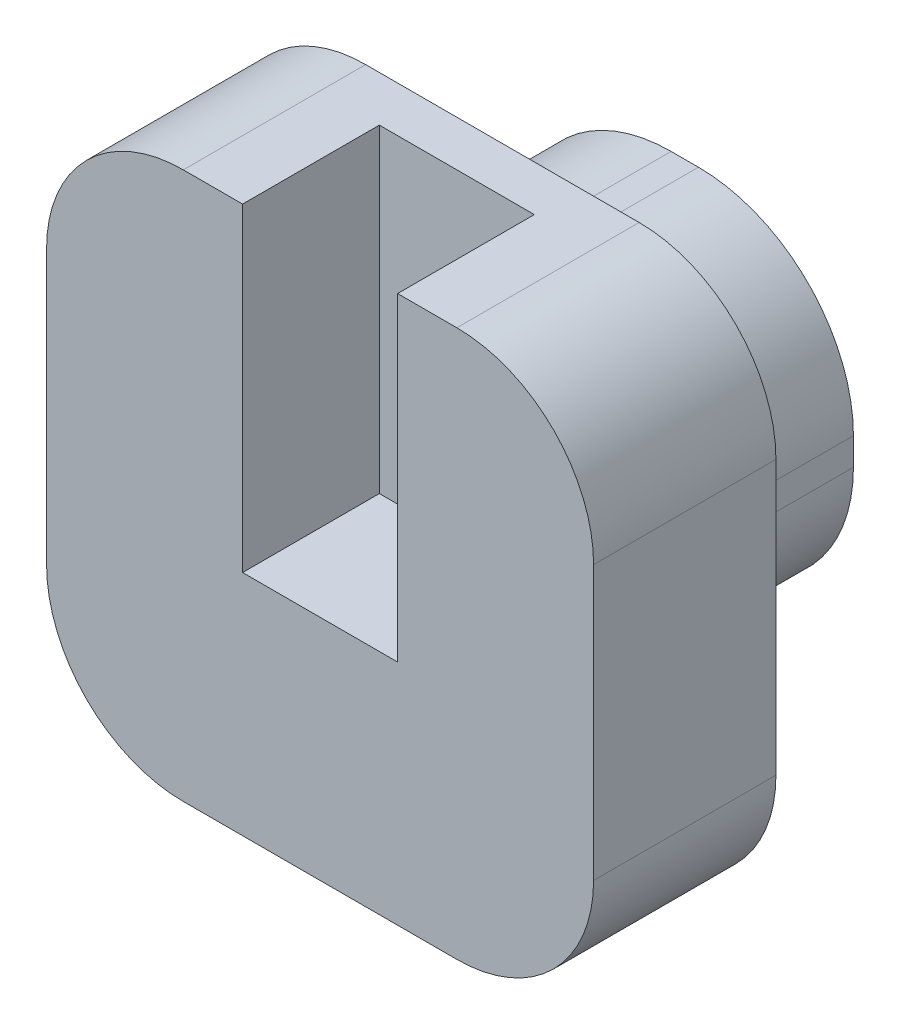
ISO-10303-21;
HEADER;
FILE_DESCRIPTION(('STEP AP214'),'2;1');
FILE_NAME('part.step','',(''),(''),'','','');
FILE_SCHEMA(('AUTOMOTIVE_DESIGN { 1 0 10303 214 1 1 1 1 }'));
ENDSEC;
DATA;
#1=APPLICATION_CONTEXT('core data for automotive mechanical design processes');
#2=APPLICATION_PROTOCOL_DEFINITION('international standard','automotive_design',2000,#1);
#3=PRODUCT_CONTEXT('',#1,'mechanical');
#4=PRODUCT('Part','Part','',(#3));
#5=PRODUCT_RELATED_PRODUCT_CATEGORY('part','',(#4));
#6=PRODUCT_DEFINITION_FORMATION('','',#4);
#7=PRODUCT_DEFINITION_CONTEXT('part definition',#1,'design');
#8=PRODUCT_DEFINITION('design','',#6,#7);
#9=PRODUCT_DEFINITION_SHAPE('','',#8);
#10=(LENGTH_UNIT() NAMED_UNIT(*) SI_UNIT(.MILLI.,.METRE.));
#11=(NAMED_UNIT(*) PLANE_ANGLE_UNIT() SI_UNIT($,.RADIAN.));
#12=(NAMED_UNIT(*) SI_UNIT($,.STERADIAN.) SOLID_ANGLE_UNIT());
#13=UNCERTAINTY_MEASURE_WITH_UNIT(LENGTH_MEASURE(1.E-05),#10,'distance_accuracy_value','');
#14=(GEOMETRIC_REPRESENTATION_CONTEXT(3) GLOBAL_UNCERTAINTY_ASSIGNED_CONTEXT((#13)) GLOBAL_UNIT_ASSIGNED_CONTEXT((#10,
#11,#12)) REPRESENTATION_CONTEXT('',''));
#15=CARTESIAN_POINT('',(0.,0.,0.));
#16=DIRECTION('',(0.,0.,1.));
#17=DIRECTION('',(1.,0.,0.));
#18=AXIS2_PLACEMENT_3D('',#15,#16,#17);
#19=CARTESIAN_POINT('',(-0.15,-0.15,2.));
#20=DIRECTION('',(0.,0.,-1.));
#21=DIRECTION('',(-1.,0.,0.));
#22=AXIS2_PLACEMENT_3D('',#19,#20,#21);
#23=CYLINDRICAL_SURFACE('',#22,1.7);
#24=CARTESIAN_POINT('',(-0.15,-0.15,0.));
#25=DIRECTION('',(0.,0.,1.));
#26=DIRECTION('',(1.,0.,0.));
#27=AXIS2_PLACEMENT_3D('',#24,#25,#26);
#28=CIRCLE('',#27,1.7);
#29=CARTESIAN_POINT('',(-1.85,-0.15,0.));
#30=VERTEX_POINT('',#29);
#31=CARTESIAN_POINT('',(-0.15,-1.85,0.));
#32=VERTEX_POINT('',#31);
#33=EDGE_CURVE('E161',#30,#32,#28,.T.);
#34=ORIENTED_EDGE('',*,*,#33,.T.);
#35=DIRECTION('',(0.,0.,-1.));
#36=VECTOR('',#35,1.);
#37=CARTESIAN_POINT('',(-0.15,-1.85,2.));
#38=LINE('',#37,#36);
#39=CARTESIAN_POINT('',(-0.15,-1.85,2.));
#40=VERTEX_POINT('',#39);
#41=EDGE_CURVE('E11',#40,#32,#38,.T.);
#42=ORIENTED_EDGE('',*,*,#41,.F.);
#43=CARTESIAN_POINT('',(-0.15,-0.15,2.));
#44=DIRECTION('',(0.,0.,1.));
#45=DIRECTION('',(1.,0.,0.));
#46=AXIS2_PLACEMENT_3D('',#43,#44,#45);
#47=CIRCLE('',#46,1.7);
#48=CARTESIAN_POINT('',(-1.85,-0.15,2.));
#49=VERTEX_POINT('',#48);
#50=EDGE_CURVE('E185',#49,#40,#47,.T.);
#51=ORIENTED_EDGE('',*,*,#50,.F.);
#52=DIRECTION('',(0.,0.,-1.));
#53=VECTOR('',#52,1.);
#54=CARTESIAN_POINT('',(-1.85,-0.15,2.));
#55=LINE('',#54,#53);
#56=EDGE_CURVE('E160',#49,#30,#55,.T.);
#57=ORIENTED_EDGE('',*,*,#56,.T.);
#58=EDGE_LOOP('',(#34,#42,#51,#57));
#59=FACE_BOUND('',#58,.T.);
#60=ADVANCED_FACE('F39',(#59),#23,.T.);
#61=CARTESIAN_POINT('',(-0.15,-1.85,2.));
#62=DIRECTION('',(0.,1.,0.));
#63=DIRECTION('',(0.,0.,1.));
#64=AXIS2_PLACEMENT_3D('',#61,#62,#63);
#65=PLANE('',#64);
#66=DIRECTION('',(1.,0.,0.));
#67=VECTOR('',#66,1.);
#68=CARTESIAN_POINT('',(-0.15,-1.85,0.));
#69=LINE('',#68,#67);
#70=CARTESIAN_POINT('',(0.150000000000001,-1.85,0.));
#71=VERTEX_POINT('',#70);
#72=EDGE_CURVE('E165',#32,#71,#69,.T.);
#73=ORIENTED_EDGE('',*,*,#72,.T.);
#74=DIRECTION('',(0.,0.,-1.));
#75=VECTOR('',#74,1.);
#76=CARTESIAN_POINT('',(0.150000000000001,-1.85,2.));
#77=LINE('',#76,#75);
#78=CARTESIAN_POINT('',(0.150000000000001,-1.85,2.));
#79=VERTEX_POINT('',#78);
#80=EDGE_CURVE('E47',#79,#71,#77,.T.);
#81=ORIENTED_EDGE('',*,*,#80,.F.);
#82=DIRECTION('',(1.,0.,0.));
#83=VECTOR('',#82,1.);
#84=CARTESIAN_POINT('',(-0.15,-1.85,2.));
#85=LINE('',#84,#83);
#86=EDGE_CURVE('E104',#40,#79,#85,.T.);
#87=ORIENTED_EDGE('',*,*,#86,.F.);
#88=ORIENTED_EDGE('',*,*,#41,.T.);
#89=EDGE_LOOP('',(#73,#81,#87,#88));
#90=FACE_BOUND('',#89,.T.);
#91=ADVANCED_FACE('F467',(#90),#65,.F.);
#92=CARTESIAN_POINT('',(0.15,-0.15,2.));
#93=DIRECTION('',(0.,0.,-1.));
#94=DIRECTION('',(-1.,0.,0.));
#95=AXIS2_PLACEMENT_3D('',#92,#93,#94);
#96=CYLINDRICAL_SURFACE('',#95,1.7);
#97=CARTESIAN_POINT('',(0.15,-0.15,0.));
#98=DIRECTION('',(0.,0.,1.));
#99=DIRECTION('',(-1.,0.,0.));
#100=AXIS2_PLACEMENT_3D('',#97,#98,#99);
#101=CIRCLE('',#100,1.7);
#102=CARTESIAN_POINT('',(1.85,-0.15,0.));
#103=VERTEX_POINT('',#102);
#104=EDGE_CURVE('E169',#71,#103,#101,.T.);
#105=ORIENTED_EDGE('',*,*,#104,.T.);
#106=DIRECTION('',(0.,0.,-1.));
#107=VECTOR('',#106,1.);
#108=CARTESIAN_POINT('',(1.85,-0.15,2.));
#109=LINE('',#108,#107);
#110=CARTESIAN_POINT('',(1.85,-0.15,2.));
#111=VERTEX_POINT('',#110);
#112=EDGE_CURVE('E194',#111,#103,#109,.T.);
#113=ORIENTED_EDGE('',*,*,#112,.F.);
#114=CARTESIAN_POINT('',(0.15,-0.15,2.));
#115=DIRECTION('',(0.,0.,1.));
#116=DIRECTION('',(-1.,0.,0.));
#117=AXIS2_PLACEMENT_3D('',#114,#115,#116);
#118=CIRCLE('',#117,1.7);
#119=EDGE_CURVE('E151',#79,#111,#118,.T.);
#120=ORIENTED_EDGE('',*,*,#119,.F.);
#121=ORIENTED_EDGE('',*,*,#80,.T.);
#122=EDGE_LOOP('',(#105,#113,#120,#121));
#123=FACE_BOUND('',#122,.T.);
#124=ADVANCED_FACE('F202',(#123),#96,.T.);
#125=CARTESIAN_POINT('',(1.85,-0.15,2.));
#126=DIRECTION('',(-1.,0.,0.));
#127=DIRECTION('',(0.,0.,1.));
#128=AXIS2_PLACEMENT_3D('',#125,#126,#127);
#129=PLANE('',#128);
#130=DIRECTION('',(0.,1.,0.));
#131=VECTOR('',#130,1.);
#132=CARTESIAN_POINT('',(1.85,-0.15,0.));
#133=LINE('',#132,#131);
#134=CARTESIAN_POINT('',(1.85,0.150000000000001,0.));
#135=VERTEX_POINT('',#134);
#136=EDGE_CURVE('E172',#103,#135,#133,.T.);
#137=ORIENTED_EDGE('',*,*,#136,.T.);
#138=DIRECTION('',(0.,0.,-1.));
#139=VECTOR('',#138,1.);
#140=CARTESIAN_POINT('',(1.85,0.150000000000001,2.));
#141=LINE('',#140,#139);
#142=CARTESIAN_POINT('',(1.85,0.150000000000001,2.));
#143=VERTEX_POINT('',#142);
#144=EDGE_CURVE('E131',#143,#135,#141,.T.);
#145=ORIENTED_EDGE('',*,*,#144,.F.);
#146=DIRECTION('',(0.,1.,0.));
#147=VECTOR('',#146,1.);
#148=CARTESIAN_POINT('',(1.85,-0.15,2.));
#149=LINE('',#148,#147);
#150=EDGE_CURVE('E147',#111,#143,#149,.T.);
#151=ORIENTED_EDGE('',*,*,#150,.F.);
#152=ORIENTED_EDGE('',*,*,#112,.T.);
#153=EDGE_LOOP('',(#137,#145,#151,#152));
#154=FACE_BOUND('',#153,.T.);
#155=ADVANCED_FACE('F208',(#154),#129,.F.);
#156=CARTESIAN_POINT('',(0.15,0.150000000000001,2.));
#157=DIRECTION('',(0.,0.,-1.));
#158=DIRECTION('',(-1.,0.,0.));
#159=AXIS2_PLACEMENT_3D('',#156,#157,#158);
#160=CYLINDRICAL_SURFACE('',#159,1.7);
#161=CARTESIAN_POINT('',(0.15,0.150000000000001,0.));
#162=DIRECTION('',(0.,0.,1.));
#163=DIRECTION('',(1.,0.,0.));
#164=AXIS2_PLACEMENT_3D('',#161,#162,#163);
#165=CIRCLE('',#164,1.7);
#166=CARTESIAN_POINT('',(0.15,1.85,0.));
#167=VERTEX_POINT('',#166);
#168=EDGE_CURVE('E127',#135,#167,#165,.T.);
#169=ORIENTED_EDGE('',*,*,#168,.T.);
#170=DIRECTION('',(0.,0.,-1.));
#171=VECTOR('',#170,1.);
#172=CARTESIAN_POINT('',(0.15,1.85,2.));
#173=LINE('',#172,#171);
#174=CARTESIAN_POINT('',(0.15,1.85,2.));
#175=VERTEX_POINT('',#174);
#176=EDGE_CURVE('E119',#175,#167,#173,.T.);
#177=ORIENTED_EDGE('',*,*,#176,.F.);
#178=CARTESIAN_POINT('',(0.15,0.150000000000001,2.));
#179=DIRECTION('',(0.,0.,1.));
#180=DIRECTION('',(1.,0.,0.));
#181=AXIS2_PLACEMENT_3D('',#178,#179,#180);
#182=CIRCLE('',#181,1.7);
#183=EDGE_CURVE('E124',#143,#175,#182,.T.);
#184=ORIENTED_EDGE('',*,*,#183,.F.);
#185=ORIENTED_EDGE('',*,*,#144,.T.);
#186=EDGE_LOOP('',(#169,#177,#184,#185));
#187=FACE_BOUND('',#186,.T.);
#188=ADVANCED_FACE('F121',(#187),#160,.T.);
#189=CARTESIAN_POINT('',(-0.15,1.85,2.));
#190=DIRECTION('',(0.,-1.,0.));
#191=DIRECTION('',(0.,0.,-1.));
#192=AXIS2_PLACEMENT_3D('',#189,#190,#191);
#193=PLANE('',#192);
#194=DIRECTION('',(-1.,0.,0.));
#195=VECTOR('',#194,1.);
#196=CARTESIAN_POINT('',(-0.15,1.85,0.));
#197=LINE('',#196,#195);
#198=CARTESIAN_POINT('',(-0.15,1.85,0.));
#199=VERTEX_POINT('',#198);
#200=EDGE_CURVE('E177',#167,#199,#197,.T.);
#201=ORIENTED_EDGE('',*,*,#200,.T.);
#202=DIRECTION('',(0.,0.,-1.));
#203=VECTOR('',#202,1.);
#204=CARTESIAN_POINT('',(-0.15,1.85,2.));
#205=LINE('',#204,#203);
#206=CARTESIAN_POINT('',(-0.15,1.85,2.));
#207=VERTEX_POINT('',#206);
#208=EDGE_CURVE('E132',#207,#199,#205,.T.);
#209=ORIENTED_EDGE('',*,*,#208,.F.);
#210=DIRECTION('',(-1.,0.,0.));
#211=VECTOR('',#210,1.);
#212=CARTESIAN_POINT('',(-0.15,1.85,2.));
#213=LINE('',#212,#211);
#214=EDGE_CURVE('E135',#175,#207,#213,.T.);
#215=ORIENTED_EDGE('',*,*,#214,.F.);
#216=ORIENTED_EDGE('',*,*,#176,.T.);
#217=EDGE_LOOP('',(#201,#209,#215,#216));
#218=FACE_BOUND('',#217,.T.);
#219=ADVANCED_FACE('F136',(#218),#193,.F.);
#220=CARTESIAN_POINT('',(-0.15,0.150000000000001,2.));
#221=DIRECTION('',(0.,0.,-1.));
#222=DIRECTION('',(-1.,0.,0.));
#223=AXIS2_PLACEMENT_3D('',#220,#221,#222);
#224=CYLINDRICAL_SURFACE('',#223,1.7);
#225=CARTESIAN_POINT('',(-0.15,0.150000000000001,0.));
#226=DIRECTION('',(0.,0.,1.));
#227=DIRECTION('',(1.,0.,0.));
#228=AXIS2_PLACEMENT_3D('',#225,#226,#227);
#229=CIRCLE('',#228,1.7);
#230=CARTESIAN_POINT('',(-1.85,0.150000000000001,0.));
#231=VERTEX_POINT('',#230);
#232=EDGE_CURVE('E180',#199,#231,#229,.T.);
#233=ORIENTED_EDGE('',*,*,#232,.T.);
#234=DIRECTION('',(0.,0.,-1.));
#235=VECTOR('',#234,1.);
#236=CARTESIAN_POINT('',(-1.85,0.150000000000001,2.));
#237=LINE('',#236,#235);
#238=CARTESIAN_POINT('',(-1.85,0.150000000000001,2.));
#239=VERTEX_POINT('',#238);
#240=EDGE_CURVE('E63',#239,#231,#237,.T.);
#241=ORIENTED_EDGE('',*,*,#240,.F.);
#242=CARTESIAN_POINT('',(-0.15,0.150000000000001,2.));
#243=DIRECTION('',(0.,0.,1.));
#244=DIRECTION('',(1.,0.,0.));
#245=AXIS2_PLACEMENT_3D('',#242,#243,#244);
#246=CIRCLE('',#245,1.7);
#247=EDGE_CURVE('E141',#207,#239,#246,.T.);
#248=ORIENTED_EDGE('',*,*,#247,.F.);
#249=ORIENTED_EDGE('',*,*,#208,.T.);
#250=EDGE_LOOP('',(#233,#241,#248,#249));
#251=FACE_BOUND('',#250,.T.);
#252=ADVANCED_FACE('F474',(#251),#224,.T.);
#253=CARTESIAN_POINT('',(-1.85,-0.15,2.));
#254=DIRECTION('',(1.,0.,0.));
#255=DIRECTION('',(0.,0.,-1.));
#256=AXIS2_PLACEMENT_3D('',#253,#254,#255);
#257=PLANE('',#256);
#258=DIRECTION('',(0.,-1.,0.));
#259=VECTOR('',#258,1.);
#260=CARTESIAN_POINT('',(-1.85,-0.15,0.));
#261=LINE('',#260,#259);
#262=EDGE_CURVE('E96',#231,#30,#261,.T.);
#263=ORIENTED_EDGE('',*,*,#262,.T.);
#264=ORIENTED_EDGE('',*,*,#56,.F.);
#265=DIRECTION('',(0.,-1.,0.));
#266=VECTOR('',#265,1.);
#267=CARTESIAN_POINT('',(-1.85,-0.15,2.));
#268=LINE('',#267,#266);
#269=EDGE_CURVE('E157',#239,#49,#268,.T.);
#270=ORIENTED_EDGE('',*,*,#269,.F.);
#271=ORIENTED_EDGE('',*,*,#240,.T.);
#272=EDGE_LOOP('',(#263,#264,#270,#271));
#273=FACE_BOUND('',#272,.T.);
#274=ADVANCED_FACE('F475',(#273),#257,.F.);
#275=CARTESIAN_POINT('',(-0.15,-0.15,0.));
#276=DIRECTION('',(0.,0.,1.));
#277=DIRECTION('',(1.,0.,0.));
#278=AXIS2_PLACEMENT_3D('',#275,#276,#277);
#279=PLANE('',#278);
#280=ORIENTED_EDGE('',*,*,#33,.F.);
#281=ORIENTED_EDGE('',*,*,#262,.F.);
#282=ORIENTED_EDGE('',*,*,#232,.F.);
#283=ORIENTED_EDGE('',*,*,#200,.F.);
#284=ORIENTED_EDGE('',*,*,#168,.F.);
#285=ORIENTED_EDGE('',*,*,#136,.F.);
#286=ORIENTED_EDGE('',*,*,#104,.F.);
#287=ORIENTED_EDGE('',*,*,#72,.F.);
#288=EDGE_LOOP('',(#280,#281,#282,#283,#284,#285,#286,#287));
#289=FACE_BOUND('',#288,.T.);
#290=ADVANCED_FACE('F206',(#289),#279,.F.);
#291=CARTESIAN_POINT('',(1.5,1.5,2.));
#292=DIRECTION('',(0.,0.,1.));
#293=DIRECTION('',(1.,0.,0.));
#294=AXIS2_PLACEMENT_3D('',#291,#292,#293);
#295=PLANE('',#294);
#296=DIRECTION('',(1.,0.,0.));
#297=VECTOR('',#296,1.);
#298=CARTESIAN_POINT('',(-1.5,3.,2.));
#299=LINE('',#298,#297);
#300=CARTESIAN_POINT('',(-1.5,3.,2.));
#301=VERTEX_POINT('',#300);
#302=CARTESIAN_POINT('',(1.5,3.,2.));
#303=VERTEX_POINT('',#302);
#304=EDGE_CURVE('E277',#301,#303,#299,.T.);
#305=ORIENTED_EDGE('',*,*,#304,.T.);
#306=CARTESIAN_POINT('',(1.5,1.5,2.));
#307=DIRECTION('',(0.,0.,1.));
#308=DIRECTION('',(1.,0.,0.));
#309=AXIS2_PLACEMENT_3D('',#306,#307,#308);
#310=CIRCLE('',#309,1.5);
#311=CARTESIAN_POINT('',(3.,1.5,2.));
#312=VERTEX_POINT('',#311);
#313=EDGE_CURVE('E273',#312,#303,#310,.T.);
#314=ORIENTED_EDGE('',*,*,#313,.F.);
#315=DIRECTION('',(0.,1.,0.));
#316=VECTOR('',#315,1.);
#317=CARTESIAN_POINT('',(3.,-1.5,2.));
#318=LINE('',#317,#316);
#319=CARTESIAN_POINT('',(3.,-1.5,2.));
#320=VERTEX_POINT('',#319);
#321=EDGE_CURVE('E269',#320,#312,#318,.T.);
#322=ORIENTED_EDGE('',*,*,#321,.F.);
#323=CARTESIAN_POINT('',(1.5,-1.5,2.));
#324=DIRECTION('',(0.,0.,1.));
#325=DIRECTION('',(1.,0.,0.));
#326=AXIS2_PLACEMENT_3D('',#323,#324,#325);
#327=CIRCLE('',#326,1.5);
#328=CARTESIAN_POINT('',(1.5,-3.,2.));
#329=VERTEX_POINT('',#328);
#330=EDGE_CURVE('E265',#329,#320,#327,.T.);
#331=ORIENTED_EDGE('',*,*,#330,.F.);
#332=DIRECTION('',(1.,0.,0.));
#333=VECTOR('',#332,1.);
#334=CARTESIAN_POINT('',(-1.5,-3.,2.));
#335=LINE('',#334,#333);
#336=CARTESIAN_POINT('',(-1.5,-3.,2.));
#337=VERTEX_POINT('',#336);
#338=EDGE_CURVE('E261',#337,#329,#335,.T.);
#339=ORIENTED_EDGE('',*,*,#338,.F.);
#340=CARTESIAN_POINT('',(-1.5,-1.5,2.));
#341=DIRECTION('',(0.,0.,-1.));
#342=DIRECTION('',(-1.,0.,0.));
#343=AXIS2_PLACEMENT_3D('',#340,#341,#342);
#344=CIRCLE('',#343,1.5);
#345=CARTESIAN_POINT('',(-3.,-1.5,2.));
#346=VERTEX_POINT('',#345);
#347=EDGE_CURVE('E257',#337,#346,#344,.T.);
#348=ORIENTED_EDGE('',*,*,#347,.T.);
#349=DIRECTION('',(0.,1.,0.));
#350=VECTOR('',#349,1.);
#351=CARTESIAN_POINT('',(-3.,-1.5,2.));
#352=LINE('',#351,#350);
#353=CARTESIAN_POINT('',(-3.,1.5,2.));
#354=VERTEX_POINT('',#353);
#355=EDGE_CURVE('E253',#346,#354,#352,.T.);
#356=ORIENTED_EDGE('',*,*,#355,.T.);
#357=CARTESIAN_POINT('',(-1.5,1.5,2.));
#358=DIRECTION('',(0.,0.,-1.));
#359=DIRECTION('',(-1.,0.,0.));
#360=AXIS2_PLACEMENT_3D('',#357,#358,#359);
#361=CIRCLE('',#360,1.5);
#362=EDGE_CURVE('E248',#354,#301,#361,.T.);
#363=ORIENTED_EDGE('',*,*,#362,.T.);
#364=EDGE_LOOP('',(#305,#314,#322,#331,#339,#348,#356,#363));
#365=FACE_BOUND('',#364,.T.);
#366=ORIENTED_EDGE('',*,*,#269,.T.);
#367=ORIENTED_EDGE('',*,*,#50,.T.);
#368=ORIENTED_EDGE('',*,*,#86,.T.);
#369=ORIENTED_EDGE('',*,*,#119,.T.);
#370=ORIENTED_EDGE('',*,*,#150,.T.);
#371=ORIENTED_EDGE('',*,*,#183,.T.);
#372=ORIENTED_EDGE('',*,*,#214,.T.);
#373=ORIENTED_EDGE('',*,*,#247,.T.);
#374=EDGE_LOOP('',(#366,#367,#368,#369,#370,#371,#372,#373));
#375=FACE_BOUND('',#374,.T.);
#376=ADVANCED_FACE('F144',(#365,#375),#295,.F.);
#377=CARTESIAN_POINT('',(-1.5,3.,4.));
#378=DIRECTION('',(0.,1.,0.));
#379=DIRECTION('',(0.,0.,1.));
#380=AXIS2_PLACEMENT_3D('',#377,#378,#379);
#381=PLANE('',#380);
#382=DIRECTION('',(0.,0.,-1.));
#383=VECTOR('',#382,1.);
#384=CARTESIAN_POINT('',(0.850000000000001,3.,4.));
#385=LINE('',#384,#383);
#386=CARTESIAN_POINT('',(0.850000000000001,3.,4.));
#387=VERTEX_POINT('',#386);
#388=CARTESIAN_POINT('',(0.850000000000001,3.,2.5));
#389=VERTEX_POINT('',#388);
#390=EDGE_CURVE('E338',#387,#389,#385,.T.);
#391=ORIENTED_EDGE('',*,*,#390,.F.);
#392=DIRECTION('',(1.,0.,0.));
#393=VECTOR('',#392,1.);
#394=CARTESIAN_POINT('',(-1.5,3.,4.));
#395=LINE('',#394,#393);
#396=CARTESIAN_POINT('',(1.5,3.,4.));
#397=VERTEX_POINT('',#396);
#398=EDGE_CURVE('E252',#387,#397,#395,.T.);
#399=ORIENTED_EDGE('',*,*,#398,.T.);
#400=DIRECTION('',(0.,0.,-1.));
#401=VECTOR('',#400,1.);
#402=CARTESIAN_POINT('',(1.5,3.,4.));
#403=LINE('',#402,#401);
#404=EDGE_CURVE('E216',#397,#303,#403,.T.);
#405=ORIENTED_EDGE('',*,*,#404,.T.);
#406=ORIENTED_EDGE('',*,*,#304,.F.);
#407=DIRECTION('',(0.,0.,-1.));
#408=VECTOR('',#407,1.);
#409=CARTESIAN_POINT('',(-1.5,3.,4.));
#410=LINE('',#409,#408);
#411=CARTESIAN_POINT('',(-1.5,3.,4.));
#412=VERTEX_POINT('',#411);
#413=EDGE_CURVE('E166',#412,#301,#410,.T.);
#414=ORIENTED_EDGE('',*,*,#413,.F.);
#415=CARTESIAN_POINT('',(-0.849999999999999,3.,4.));
#416=VERTEX_POINT('',#415);
#417=EDGE_CURVE('E309',#412,#416,#395,.T.);
#418=ORIENTED_EDGE('',*,*,#417,.T.);
#419=DIRECTION('',(0.,0.,1.));
#420=VECTOR('',#419,1.);
#421=CARTESIAN_POINT('',(-0.849999999999999,3.,4.));
#422=LINE('',#421,#420);
#423=CARTESIAN_POINT('',(-0.849999999999999,3.,2.5));
#424=VERTEX_POINT('',#423);
#425=EDGE_CURVE('E329',#424,#416,#422,.T.);
#426=ORIENTED_EDGE('',*,*,#425,.F.);
#427=DIRECTION('',(-1.,0.,0.));
#428=VECTOR('',#427,1.);
#429=CARTESIAN_POINT('',(-0.849999999999999,3.,2.5));
#430=LINE('',#429,#428);
#431=EDGE_CURVE('E334',#389,#424,#430,.T.);
#432=ORIENTED_EDGE('',*,*,#431,.F.);
#433=EDGE_LOOP('',(#391,#399,#405,#406,#414,#418,#426,#432));
#434=FACE_BOUND('',#433,.T.);
#435=ADVANCED_FACE('F418',(#434),#381,.T.);
#436=CARTESIAN_POINT('',(-1.5,1.5,4.));
#437=DIRECTION('',(0.,0.,-1.));
#438=DIRECTION('',(-1.,0.,0.));
#439=AXIS2_PLACEMENT_3D('',#436,#437,#438);
#440=CYLINDRICAL_SURFACE('',#439,1.5);
#441=ORIENTED_EDGE('',*,*,#362,.F.);
#442=DIRECTION('',(0.,0.,-1.));
#443=VECTOR('',#442,1.);
#444=CARTESIAN_POINT('',(-3.,1.5,4.));
#445=LINE('',#444,#443);
#446=CARTESIAN_POINT('',(-3.,1.5,4.));
#447=VERTEX_POINT('',#446);
#448=EDGE_CURVE('E241',#447,#354,#445,.T.);
#449=ORIENTED_EDGE('',*,*,#448,.F.);
#450=CARTESIAN_POINT('',(-1.5,1.5,4.));
#451=DIRECTION('',(0.,0.,-1.));
#452=DIRECTION('',(-1.,0.,0.));
#453=AXIS2_PLACEMENT_3D('',#450,#451,#452);
#454=CIRCLE('',#453,1.5);
#455=EDGE_CURVE('E221',#447,#412,#454,.T.);
#456=ORIENTED_EDGE('',*,*,#455,.T.);
#457=ORIENTED_EDGE('',*,*,#413,.T.);
#458=EDGE_LOOP('',(#441,#449,#456,#457));
#459=FACE_BOUND('',#458,.T.);
#460=ADVANCED_FACE('F414',(#459),#440,.T.);
#461=CARTESIAN_POINT('',(-3.,-1.5,4.));
#462=DIRECTION('',(-1.,0.,0.));
#463=DIRECTION('',(0.,0.,1.));
#464=AXIS2_PLACEMENT_3D('',#461,#462,#463);
#465=PLANE('',#464);
#466=ORIENTED_EDGE('',*,*,#355,.F.);
#467=DIRECTION('',(0.,0.,-1.));
#468=VECTOR('',#467,1.);
#469=CARTESIAN_POINT('',(-3.,-1.5,4.));
#470=LINE('',#469,#468);
#471=CARTESIAN_POINT('',(-3.,-1.5,4.));
#472=VERTEX_POINT('',#471);
#473=EDGE_CURVE('E237',#472,#346,#470,.T.);
#474=ORIENTED_EDGE('',*,*,#473,.F.);
#475=DIRECTION('',(0.,1.,0.));
#476=VECTOR('',#475,1.);
#477=CARTESIAN_POINT('',(-3.,-1.5,4.));
#478=LINE('',#477,#476);
#479=EDGE_CURVE('E285',#472,#447,#478,.T.);
#480=ORIENTED_EDGE('',*,*,#479,.T.);
#481=ORIENTED_EDGE('',*,*,#448,.T.);
#482=EDGE_LOOP('',(#466,#474,#480,#481));
#483=FACE_BOUND('',#482,.T.);
#484=ADVANCED_FACE('F426',(#483),#465,.T.);
#485=CARTESIAN_POINT('',(-1.5,-1.5,4.));
#486=DIRECTION('',(0.,0.,-1.));
#487=DIRECTION('',(-1.,0.,0.));
#488=AXIS2_PLACEMENT_3D('',#485,#486,#487);
#489=CYLINDRICAL_SURFACE('',#488,1.5);
#490=ORIENTED_EDGE('',*,*,#347,.F.);
#491=DIRECTION('',(0.,0.,-1.));
#492=VECTOR('',#491,1.);
#493=CARTESIAN_POINT('',(-1.5,-3.,4.));
#494=LINE('',#493,#492);
#495=CARTESIAN_POINT('',(-1.5,-3.,4.));
#496=VERTEX_POINT('',#495);
#497=EDGE_CURVE('E233',#496,#337,#494,.T.);
#498=ORIENTED_EDGE('',*,*,#497,.F.);
#499=CARTESIAN_POINT('',(-1.5,-1.5,4.));
#500=DIRECTION('',(0.,0.,-1.));
#501=DIRECTION('',(-1.,0.,0.));
#502=AXIS2_PLACEMENT_3D('',#499,#500,#501);
#503=CIRCLE('',#502,1.5);
#504=EDGE_CURVE('E289',#496,#472,#503,.T.);
#505=ORIENTED_EDGE('',*,*,#504,.T.);
#506=ORIENTED_EDGE('',*,*,#473,.T.);
#507=EDGE_LOOP('',(#490,#498,#505,#506));
#508=FACE_BOUND('',#507,.T.);
#509=ADVANCED_FACE('F457',(#508),#489,.T.);
#510=CARTESIAN_POINT('',(-1.5,-3.,4.));
#511=DIRECTION('',(0.,1.,0.));
#512=DIRECTION('',(0.,0.,1.));
#513=AXIS2_PLACEMENT_3D('',#510,#511,#512);
#514=PLANE('',#513);
#515=ORIENTED_EDGE('',*,*,#338,.T.);
#516=DIRECTION('',(0.,0.,-1.));
#517=VECTOR('',#516,1.);
#518=CARTESIAN_POINT('',(1.5,-3.,4.));
#519=LINE('',#518,#517);
#520=CARTESIAN_POINT('',(1.5,-3.,4.));
#521=VERTEX_POINT('',#520);
#522=EDGE_CURVE('E229',#521,#329,#519,.T.);
#523=ORIENTED_EDGE('',*,*,#522,.F.);
#524=DIRECTION('',(1.,0.,0.));
#525=VECTOR('',#524,1.);
#526=CARTESIAN_POINT('',(-1.5,-3.,4.));
#527=LINE('',#526,#525);
#528=EDGE_CURVE('E293',#496,#521,#527,.T.);
#529=ORIENTED_EDGE('',*,*,#528,.F.);
#530=ORIENTED_EDGE('',*,*,#497,.T.);
#531=EDGE_LOOP('',(#515,#523,#529,#530));
#532=FACE_BOUND('',#531,.T.);
#533=ADVANCED_FACE('F455',(#532),#514,.F.);
#534=CARTESIAN_POINT('',(1.5,-1.5,4.));
#535=DIRECTION('',(0.,0.,-1.));
#536=DIRECTION('',(-1.,0.,0.));
#537=AXIS2_PLACEMENT_3D('',#534,#535,#536);
#538=CYLINDRICAL_SURFACE('',#537,1.5);
#539=ORIENTED_EDGE('',*,*,#330,.T.);
#540=DIRECTION('',(0.,0.,-1.));
#541=VECTOR('',#540,1.);
#542=CARTESIAN_POINT('',(3.,-1.5,4.));
#543=LINE('',#542,#541);
#544=CARTESIAN_POINT('',(3.,-1.5,4.));
#545=VERTEX_POINT('',#544);
#546=EDGE_CURVE('E225',#545,#320,#543,.T.);
#547=ORIENTED_EDGE('',*,*,#546,.F.);
#548=CARTESIAN_POINT('',(1.5,-1.5,4.));
#549=DIRECTION('',(0.,0.,1.));
#550=DIRECTION('',(1.,0.,0.));
#551=AXIS2_PLACEMENT_3D('',#548,#549,#550);
#552=CIRCLE('',#551,1.5);
#553=EDGE_CURVE('E297',#521,#545,#552,.T.);
#554=ORIENTED_EDGE('',*,*,#553,.F.);
#555=ORIENTED_EDGE('',*,*,#522,.T.);
#556=EDGE_LOOP('',(#539,#547,#554,#555));
#557=FACE_BOUND('',#556,.T.);
#558=ADVANCED_FACE('F451',(#557),#538,.T.);
#559=CARTESIAN_POINT('',(3.,-1.5,4.));
#560=DIRECTION('',(-1.,0.,0.));
#561=DIRECTION('',(0.,-1.,0.));
#562=AXIS2_PLACEMENT_3D('',#559,#560,#561);
#563=PLANE('',#562);
#564=ORIENTED_EDGE('',*,*,#321,.T.);
#565=DIRECTION('',(0.,0.,-1.));
#566=VECTOR('',#565,1.);
#567=CARTESIAN_POINT('',(3.,1.5,4.));
#568=LINE('',#567,#566);
#569=CARTESIAN_POINT('',(3.,1.5,4.));
#570=VERTEX_POINT('',#569);
#571=EDGE_CURVE('E220',#570,#312,#568,.T.);
#572=ORIENTED_EDGE('',*,*,#571,.F.);
#573=DIRECTION('',(0.,1.,0.));
#574=VECTOR('',#573,1.);
#575=CARTESIAN_POINT('',(3.,-1.5,4.));
#576=LINE('',#575,#574);
#577=EDGE_CURVE('E301',#545,#570,#576,.T.);
#578=ORIENTED_EDGE('',*,*,#577,.F.);
#579=ORIENTED_EDGE('',*,*,#546,.T.);
#580=EDGE_LOOP('',(#564,#572,#578,#579));
#581=FACE_BOUND('',#580,.T.);
#582=ADVANCED_FACE('F447',(#581),#563,.F.);
#583=CARTESIAN_POINT('',(1.5,1.5,4.));
#584=DIRECTION('',(0.,0.,-1.));
#585=DIRECTION('',(-1.,0.,0.));
#586=AXIS2_PLACEMENT_3D('',#583,#584,#585);
#587=CYLINDRICAL_SURFACE('',#586,1.5);
#588=ORIENTED_EDGE('',*,*,#313,.T.);
#589=ORIENTED_EDGE('',*,*,#404,.F.);
#590=CARTESIAN_POINT('',(1.5,1.5,4.));
#591=DIRECTION('',(0.,0.,1.));
#592=DIRECTION('',(1.,0.,0.));
#593=AXIS2_PLACEMENT_3D('',#590,#591,#592);
#594=CIRCLE('',#593,1.5);
#595=EDGE_CURVE('E305',#570,#397,#594,.T.);
#596=ORIENTED_EDGE('',*,*,#595,.F.);
#597=ORIENTED_EDGE('',*,*,#571,.T.);
#598=EDGE_LOOP('',(#588,#589,#596,#597));
#599=FACE_BOUND('',#598,.T.);
#600=ADVANCED_FACE('F443',(#599),#587,.T.);
#601=CARTESIAN_POINT('',(1.5,1.5,4.));
#602=DIRECTION('',(0.,0.,1.));
#603=DIRECTION('',(1.,0.,0.));
#604=AXIS2_PLACEMENT_3D('',#601,#602,#603);
#605=PLANE('',#604);
#606=DIRECTION('',(0.,1.,0.));
#607=VECTOR('',#606,1.);
#608=CARTESIAN_POINT('',(0.850000000000001,-0.5,4.));
#609=LINE('',#608,#607);
#610=CARTESIAN_POINT('',(0.850000000000001,-0.5,4.));
#611=VERTEX_POINT('',#610);
#612=EDGE_CURVE('E281',#611,#387,#609,.T.);
#613=ORIENTED_EDGE('',*,*,#612,.F.);
#614=DIRECTION('',(1.,0.,0.));
#615=VECTOR('',#614,1.);
#616=CARTESIAN_POINT('',(-0.849999999999999,-0.5,4.));
#617=LINE('',#616,#615);
#618=CARTESIAN_POINT('',(-0.849999999999999,-0.5,4.));
#619=VERTEX_POINT('',#618);
#620=EDGE_CURVE('E318',#619,#611,#617,.T.);
#621=ORIENTED_EDGE('',*,*,#620,.F.);
#622=DIRECTION('',(0.,1.,0.));
#623=VECTOR('',#622,1.);
#624=CARTESIAN_POINT('',(-0.849999999999999,-0.5,4.));
#625=LINE('',#624,#623);
#626=EDGE_CURVE('E322',#619,#416,#625,.T.);
#627=ORIENTED_EDGE('',*,*,#626,.T.);
#628=ORIENTED_EDGE('',*,*,#417,.F.);
#629=ORIENTED_EDGE('',*,*,#455,.F.);
#630=ORIENTED_EDGE('',*,*,#479,.F.);
#631=ORIENTED_EDGE('',*,*,#504,.F.);
#632=ORIENTED_EDGE('',*,*,#528,.T.);
#633=ORIENTED_EDGE('',*,*,#553,.T.);
#634=ORIENTED_EDGE('',*,*,#577,.T.);
#635=ORIENTED_EDGE('',*,*,#595,.T.);
#636=ORIENTED_EDGE('',*,*,#398,.F.);
#637=EDGE_LOOP('',(#613,#621,#627,#628,#629,#630,#631,#632,#633,#634,#635,#636));
#638=FACE_BOUND('',#637,.T.);
#639=ADVANCED_FACE('F430',(#638),#605,.T.);
#640=CARTESIAN_POINT('',(0.850000000000001,-0.5,4.));
#641=DIRECTION('',(1.,0.,0.));
#642=DIRECTION('',(0.,0.,-1.));
#643=AXIS2_PLACEMENT_3D('',#640,#641,#642);
#644=PLANE('',#643);
#645=ORIENTED_EDGE('',*,*,#390,.T.);
#646=DIRECTION('',(0.,1.,0.));
#647=VECTOR('',#646,1.);
#648=CARTESIAN_POINT('',(0.850000000000001,-0.5,2.5));
#649=LINE('',#648,#647);
#650=CARTESIAN_POINT('',(0.850000000000001,-0.5,2.5));
#651=VERTEX_POINT('',#650);
#652=EDGE_CURVE('E313',#651,#389,#649,.T.);
#653=ORIENTED_EDGE('',*,*,#652,.F.);
#654=DIRECTION('',(0.,0.,-1.));
#655=VECTOR('',#654,1.);
#656=CARTESIAN_POINT('',(0.850000000000001,-0.5,4.));
#657=LINE('',#656,#655);
#658=EDGE_CURVE('E333',#611,#651,#657,.T.);
#659=ORIENTED_EDGE('',*,*,#658,.F.);
#660=ORIENTED_EDGE('',*,*,#612,.T.);
#661=EDGE_LOOP('',(#645,#653,#659,#660));
#662=FACE_BOUND('',#661,.T.);
#663=ADVANCED_FACE('F363',(#662),#644,.F.);
#664=CARTESIAN_POINT('',(-0.849999999999999,-0.5,4.));
#665=DIRECTION('',(-1.,0.,0.));
#666=DIRECTION('',(0.,0.,1.));
#667=AXIS2_PLACEMENT_3D('',#664,#665,#666);
#668=PLANE('',#667);
#669=ORIENTED_EDGE('',*,*,#425,.T.);
#670=ORIENTED_EDGE('',*,*,#626,.F.);
#671=DIRECTION('',(0.,0.,1.));
#672=VECTOR('',#671,1.);
#673=CARTESIAN_POINT('',(-0.849999999999999,-0.5,4.));
#674=LINE('',#673,#672);
#675=CARTESIAN_POINT('',(-0.849999999999999,-0.5,2.5));
#676=VERTEX_POINT('',#675);
#677=EDGE_CURVE('E54',#676,#619,#674,.T.);
#678=ORIENTED_EDGE('',*,*,#677,.F.);
#679=DIRECTION('',(0.,1.,0.));
#680=VECTOR('',#679,1.);
#681=CARTESIAN_POINT('',(-0.849999999999999,-0.5,2.5));
#682=LINE('',#681,#680);
#683=EDGE_CURVE('E317',#676,#424,#682,.T.);
#684=ORIENTED_EDGE('',*,*,#683,.T.);
#685=EDGE_LOOP('',(#669,#670,#678,#684));
#686=FACE_BOUND('',#685,.T.);
#687=ADVANCED_FACE('F434',(#686),#668,.F.);
#688=CARTESIAN_POINT('',(-0.849999999999999,-0.5,2.5));
#689=DIRECTION('',(0.,0.,-1.));
#690=DIRECTION('',(-1.,0.,0.));
#691=AXIS2_PLACEMENT_3D('',#688,#689,#690);
#692=PLANE('',#691);
#693=ORIENTED_EDGE('',*,*,#431,.T.);
#694=ORIENTED_EDGE('',*,*,#683,.F.);
#695=DIRECTION('',(-1.,0.,0.));
#696=VECTOR('',#695,1.);
#697=CARTESIAN_POINT('',(-0.849999999999999,-0.5,2.5));
#698=LINE('',#697,#696);
#699=EDGE_CURVE('E346',#651,#676,#698,.T.);
#700=ORIENTED_EDGE('',*,*,#699,.F.);
#701=ORIENTED_EDGE('',*,*,#652,.T.);
#702=EDGE_LOOP('',(#693,#694,#700,#701));
#703=FACE_BOUND('',#702,.T.);
#704=ADVANCED_FACE('F436',(#703),#692,.F.);
#705=CARTESIAN_POINT('',(0.,-0.5,0.));
#706=DIRECTION('',(0.,-1.,0.));
#707=DIRECTION('',(0.,0.,-1.));
#708=AXIS2_PLACEMENT_3D('',#705,#706,#707);
#709=PLANE('',#708);
#710=ORIENTED_EDGE('',*,*,#658,.T.);
#711=ORIENTED_EDGE('',*,*,#699,.T.);
#712=ORIENTED_EDGE('',*,*,#677,.T.);
#713=ORIENTED_EDGE('',*,*,#620,.T.);
#714=EDGE_LOOP('',(#710,#711,#712,#713));
#715=FACE_BOUND('',#714,.T.);
#716=ADVANCED_FACE('F353',(#715),#709,.F.);
#717=CLOSED_SHELL('',(#60,#91,#124,#155,#188,#219,#252,#274,#290,#376,#435,#460,#484,#509,#533,
#558,#582,#600,#639,#663,#687,#704,#716));
#718=MANIFOLD_SOLID_BREP('B2',#717);
#719=ADVANCED_BREP_SHAPE_REPRESENTATION('',(#18,#718),#14);
#720=SHAPE_DEFINITION_REPRESENTATION(#9,#719);
ENDSEC;
END-ISO-10303-21;
